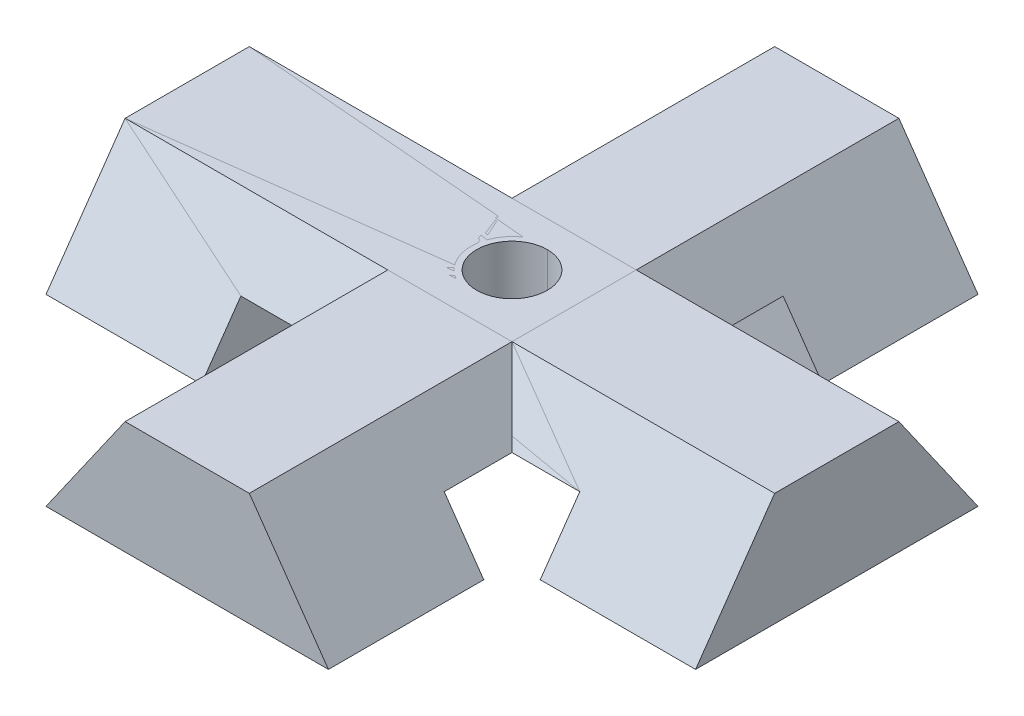
ISO-10303-21;
HEADER;
FILE_DESCRIPTION(('STEP AP214'),'2;1');
FILE_NAME('part.step','',(''),(''),'','','');
FILE_SCHEMA(('AUTOMOTIVE_DESIGN { 1 0 10303 214 1 1 1 1 }'));
ENDSEC;
DATA;
#1=APPLICATION_CONTEXT('core data for automotive mechanical design processes');
#2=APPLICATION_PROTOCOL_DEFINITION('international standard','automotive_design',2000,#1);
#3=PRODUCT_CONTEXT('',#1,'mechanical');
#4=PRODUCT('Part','Part','',(#3));
#5=PRODUCT_RELATED_PRODUCT_CATEGORY('part','',(#4));
#6=PRODUCT_DEFINITION_FORMATION('','',#4);
#7=PRODUCT_DEFINITION_CONTEXT('part definition',#1,'design');
#8=PRODUCT_DEFINITION('design','',#6,#7);
#9=PRODUCT_DEFINITION_SHAPE('','',#8);
#10=(LENGTH_UNIT() NAMED_UNIT(*) SI_UNIT(.MILLI.,.METRE.));
#11=(NAMED_UNIT(*) PLANE_ANGLE_UNIT() SI_UNIT($,.RADIAN.));
#12=(NAMED_UNIT(*) SI_UNIT($,.STERADIAN.) SOLID_ANGLE_UNIT());
#13=UNCERTAINTY_MEASURE_WITH_UNIT(LENGTH_MEASURE(1.E-05),#10,'distance_accuracy_value','');
#14=(GEOMETRIC_REPRESENTATION_CONTEXT(3) GLOBAL_UNCERTAINTY_ASSIGNED_CONTEXT((#13)) GLOBAL_UNIT_ASSIGNED_CONTEXT((#10,
#11,#12)) REPRESENTATION_CONTEXT('',''));
#15=CARTESIAN_POINT('',(0.,0.,0.));
#16=DIRECTION('',(0.,0.,1.));
#17=DIRECTION('',(1.,0.,0.));
#18=AXIS2_PLACEMENT_3D('',#15,#16,#17);
#19=CARTESIAN_POINT('',(0.,-4.,0.));
#20=DIRECTION('',(0.,-1.,0.));
#21=DIRECTION('',(0.,0.,-1.));
#22=AXIS2_PLACEMENT_3D('',#19,#20,#21);
#23=PLANE('',#22);
#24=DIRECTION('',(0.,0.,1.));
#25=VECTOR('',#24,1.);
#26=CARTESIAN_POINT('',(-5.,-4.,11.5));
#27=LINE('',#26,#25);
#28=CARTESIAN_POINT('',(-5.,-4.,6.00000000000002));
#29=VERTEX_POINT('',#28);
#30=CARTESIAN_POINT('',(-5.,-4.,11.5));
#31=VERTEX_POINT('',#30);
#32=EDGE_CURVE('P0_E246',#29,#31,#27,.T.);
#33=ORIENTED_EDGE('',*,*,#32,.F.);
#34=DIRECTION('',(1.,0.,0.));
#35=VECTOR('',#34,1.);
#36=CARTESIAN_POINT('',(0.,-4.,6.));
#37=LINE('',#36,#35);
#38=CARTESIAN_POINT('',(5.,-4.,6.));
#39=VERTEX_POINT('',#38);
#40=EDGE_CURVE('P0_E358',#29,#39,#37,.T.);
#41=ORIENTED_EDGE('',*,*,#40,.T.);
#42=DIRECTION('',(0.,0.,-1.));
#43=VECTOR('',#42,1.);
#44=CARTESIAN_POINT('',(5.,-4.,11.5));
#45=LINE('',#44,#43);
#46=CARTESIAN_POINT('',(5.,-4.,11.5));
#47=VERTEX_POINT('',#46);
#48=EDGE_CURVE('P0_E240',#47,#39,#45,.T.);
#49=ORIENTED_EDGE('',*,*,#48,.F.);
#50=DIRECTION('',(1.,0.,0.));
#51=VECTOR('',#50,1.);
#52=CARTESIAN_POINT('',(-5.,-4.,11.5));
#53=LINE('',#52,#51);
#54=EDGE_CURVE('P0_E242',#31,#47,#53,.T.);
#55=ORIENTED_EDGE('',*,*,#54,.F.);
#56=EDGE_LOOP('',(#33,#41,#49,#55));
#57=FACE_BOUND('',#56,.T.);
#58=ADVANCED_FACE('P0_F51',(#57),#23,.T.);
#59=CARTESIAN_POINT('',(11.5,-4.,-5.));
#60=DIRECTION('',(0.,-0.573576436351041,0.819152044288995));
#61=DIRECTION('',(-1.,0.,0.));
#62=AXIS2_PLACEMENT_3D('',#59,#60,#61);
#63=PLANE('',#62);
#64=DIRECTION('',(-1.,0.,0.));
#65=VECTOR('',#64,1.);
#66=CARTESIAN_POINT('',(0.,-2.,-3.5995849235806));
#67=LINE('',#66,#65);
#68=CARTESIAN_POINT('',(6.,-2.,-3.5995849235806));
#69=VERTEX_POINT('',#68);
#70=CARTESIAN_POINT('',(3.59958492358059,-2.,-3.5995849235806));
#71=VERTEX_POINT('',#70);
#72=EDGE_CURVE('P0_E276',#69,#71,#67,.T.);
#73=ORIENTED_EDGE('',*,*,#72,.T.);
#74=DIRECTION('',(-0.497542812164523,0.710564775461633,0.497542812164519));
#75=VECTOR('',#74,1.);
#76=CARTESIAN_POINT('',(9.70224594007863,-10.7155031665345,-9.70224594007859));
#77=LINE('',#76,#75);
#78=CARTESIAN_POINT('',(2.19916984716118,0.,-2.19916984716119));
#79=VERTEX_POINT('',#78);
#80=EDGE_CURVE('P0_E389',#71,#79,#77,.T.);
#81=ORIENTED_EDGE('',*,*,#80,.T.);
#82=DIRECTION('',(-1.,0.,0.));
#83=VECTOR('',#82,1.);
#84=CARTESIAN_POINT('',(11.5,0.,-2.19916984716119));
#85=LINE('',#84,#83);
#86=CARTESIAN_POINT('',(11.5,0.,-2.19916984716119));
#87=VERTEX_POINT('',#86);
#88=EDGE_CURVE('P0_E301',#87,#79,#85,.T.);
#89=ORIENTED_EDGE('',*,*,#88,.F.);
#90=DIRECTION('',(0.,0.819152044288995,0.573576436351041));
#91=VECTOR('',#90,1.);
#92=CARTESIAN_POINT('',(11.5,-4.,-5.));
#93=LINE('',#92,#91);
#94=CARTESIAN_POINT('',(11.5,-4.,-5.));
#95=VERTEX_POINT('',#94);
#96=EDGE_CURVE('P0_E259',#95,#87,#93,.T.);
#97=ORIENTED_EDGE('',*,*,#96,.F.);
#98=DIRECTION('',(1.,0.,0.));
#99=VECTOR('',#98,1.);
#100=CARTESIAN_POINT('',(11.5,-4.,-5.));
#101=LINE('',#100,#99);
#102=CARTESIAN_POINT('',(6.,-4.,-5.));
#103=VERTEX_POINT('',#102);
#104=EDGE_CURVE('P0_E316',#103,#95,#101,.T.);
#105=ORIENTED_EDGE('',*,*,#104,.F.);
#106=DIRECTION('',(0.,-0.819152044288995,-0.573576436351041));
#107=VECTOR('',#106,1.);
#108=CARTESIAN_POINT('',(6.,-2.,-3.5995849235806));
#109=LINE('',#108,#107);
#110=EDGE_CURVE('P0_E289',#69,#103,#109,.T.);
#111=ORIENTED_EDGE('',*,*,#110,.F.);
#112=EDGE_LOOP('',(#73,#81,#89,#97,#105,#111));
#113=FACE_BOUND('',#112,.T.);
#114=ADVANCED_FACE('P0_F421',(#113),#63,.F.);
#115=CARTESIAN_POINT('',(11.5,0.,2.19916984716119));
#116=DIRECTION('',(0.,-0.573576436351042,-0.819152044288995));
#117=DIRECTION('',(0.,-0.819152044288995,0.573576436351042));
#118=AXIS2_PLACEMENT_3D('',#115,#116,#117);
#119=PLANE('',#118);
#120=DIRECTION('',(-1.,0.,0.));
#121=VECTOR('',#120,1.);
#122=CARTESIAN_POINT('',(11.5,0.,2.19916984716119));
#123=LINE('',#122,#121);
#124=CARTESIAN_POINT('',(11.5,0.,2.19916984716119));
#125=VERTEX_POINT('',#124);
#126=CARTESIAN_POINT('',(2.19916984716117,0.,2.19916984716119));
#127=VERTEX_POINT('',#126);
#128=EDGE_CURVE('P0_E305',#125,#127,#123,.T.);
#129=ORIENTED_EDGE('',*,*,#128,.T.);
#130=DIRECTION('',(0.497542812164523,-0.710564775461633,0.497542812164519));
#131=VECTOR('',#130,1.);
#132=CARTESIAN_POINT('',(1.20359885130097,1.42182273330802,1.203598851301));
#133=LINE('',#132,#131);
#134=CARTESIAN_POINT('',(3.59958492358059,-2.,3.5995849235806));
#135=VERTEX_POINT('',#134);
#136=EDGE_CURVE('P0_E376',#127,#135,#133,.T.);
#137=ORIENTED_EDGE('',*,*,#136,.T.);
#138=DIRECTION('',(1.,0.,0.));
#139=VECTOR('',#138,1.);
#140=CARTESIAN_POINT('',(0.,-2.,3.5995849235806));
#141=LINE('',#140,#139);
#142=CARTESIAN_POINT('',(6.,-2.,3.5995849235806));
#143=VERTEX_POINT('',#142);
#144=EDGE_CURVE('P0_E263',#135,#143,#141,.T.);
#145=ORIENTED_EDGE('',*,*,#144,.T.);
#146=DIRECTION('',(0.,0.819152044288995,-0.573576436351042));
#147=VECTOR('',#146,1.);
#148=CARTESIAN_POINT('',(6.,-4.,5.));
#149=LINE('',#148,#147);
#150=CARTESIAN_POINT('',(6.,-4.,5.));
#151=VERTEX_POINT('',#150);
#152=EDGE_CURVE('P0_E293',#151,#143,#149,.T.);
#153=ORIENTED_EDGE('',*,*,#152,.F.);
#154=DIRECTION('',(-1.,0.,0.));
#155=VECTOR('',#154,1.);
#156=CARTESIAN_POINT('',(11.5,-4.,5.));
#157=LINE('',#156,#155);
#158=CARTESIAN_POINT('',(11.5,-4.,5.));
#159=VERTEX_POINT('',#158);
#160=EDGE_CURVE('P0_E308',#159,#151,#157,.T.);
#161=ORIENTED_EDGE('',*,*,#160,.F.);
#162=DIRECTION('',(0.,-0.819152044288995,0.573576436351042));
#163=VECTOR('',#162,1.);
#164=CARTESIAN_POINT('',(11.5,0.,2.19916984716119));
#165=LINE('',#164,#163);
#166=EDGE_CURVE('P0_E258',#125,#159,#165,.T.);
#167=ORIENTED_EDGE('',*,*,#166,.F.);
#168=EDGE_LOOP('',(#129,#137,#145,#153,#161,#167));
#169=FACE_BOUND('',#168,.T.);
#170=ADVANCED_FACE('P0_F430',(#169),#119,.F.);
#171=CARTESIAN_POINT('',(6.,0.,0.));
#172=DIRECTION('',(-1.,0.,0.));
#173=DIRECTION('',(0.,0.,1.));
#174=AXIS2_PLACEMENT_3D('',#171,#172,#173);
#175=PLANE('',#174);
#176=ORIENTED_EDGE('',*,*,#152,.T.);
#177=DIRECTION('',(0.,0.,-1.));
#178=VECTOR('',#177,1.);
#179=CARTESIAN_POINT('',(6.,-2.,3.5995849235806));
#180=LINE('',#179,#178);
#181=EDGE_CURVE('P0_E234',#143,#69,#180,.T.);
#182=ORIENTED_EDGE('',*,*,#181,.T.);
#183=ORIENTED_EDGE('',*,*,#110,.T.);
#184=DIRECTION('',(0.,0.,1.));
#185=VECTOR('',#184,1.);
#186=CARTESIAN_POINT('',(6.,-4.,-5.));
#187=LINE('',#186,#185);
#188=EDGE_CURVE('P0_E312',#103,#151,#187,.T.);
#189=ORIENTED_EDGE('',*,*,#188,.T.);
#190=EDGE_LOOP('',(#176,#182,#183,#189));
#191=FACE_BOUND('',#190,.T.);
#192=ADVANCED_FACE('P0_F450',(#191),#175,.T.);
#193=CARTESIAN_POINT('',(-6.,0.,0.));
#194=DIRECTION('',(-1.,0.,0.));
#195=DIRECTION('',(0.,0.,1.));
#196=AXIS2_PLACEMENT_3D('',#193,#194,#195);
#197=PLANE('',#196);
#198=DIRECTION('',(0.,-0.819152044288995,0.573576436351042));
#199=VECTOR('',#198,1.);
#200=CARTESIAN_POINT('',(-6.,-2.,3.5995849235806));
#201=LINE('',#200,#199);
#202=CARTESIAN_POINT('',(-6.,-2.,3.5995849235806));
#203=VERTEX_POINT('',#202);
#204=CARTESIAN_POINT('',(-6.,-4.,5.));
#205=VERTEX_POINT('',#204);
#206=EDGE_CURVE('P0_E330',#203,#205,#201,.T.);
#207=ORIENTED_EDGE('',*,*,#206,.T.);
#208=DIRECTION('',(0.,0.,-1.));
#209=VECTOR('',#208,1.);
#210=CARTESIAN_POINT('',(-6.,-4.,5.));
#211=LINE('',#210,#209);
#212=CARTESIAN_POINT('',(-6.,-4.,-5.));
#213=VERTEX_POINT('',#212);
#214=EDGE_CURVE('P0_E323',#205,#213,#211,.T.);
#215=ORIENTED_EDGE('',*,*,#214,.T.);
#216=DIRECTION('',(0.,0.819152044288995,0.573576436351041));
#217=VECTOR('',#216,1.);
#218=CARTESIAN_POINT('',(-6.,-4.,-5.));
#219=LINE('',#218,#217);
#220=CARTESIAN_POINT('',(-6.,-2.,-3.5995849235806));
#221=VERTEX_POINT('',#220);
#222=EDGE_CURVE('P0_E292',#213,#221,#219,.T.);
#223=ORIENTED_EDGE('',*,*,#222,.T.);
#224=DIRECTION('',(0.,0.,1.));
#225=VECTOR('',#224,1.);
#226=CARTESIAN_POINT('',(-6.,-2.,-3.5995849235806));
#227=LINE('',#226,#225);
#228=EDGE_CURVE('P0_E264',#221,#203,#227,.T.);
#229=ORIENTED_EDGE('',*,*,#228,.T.);
#230=EDGE_LOOP('',(#207,#215,#223,#229));
#231=FACE_BOUND('',#230,.T.);
#232=ADVANCED_FACE('P0_F53',(#231),#197,.F.);
#233=CARTESIAN_POINT('',(-2.19916984716117,0.,-2.1991698471612));
#234=VERTEX_POINT('',#233);
#235=CARTESIAN_POINT('',(-11.5,0.,-2.19916984716119));
#236=VERTEX_POINT('',#235);
#237=EDGE_CURVE('P0_E300',#234,#236,#85,.T.);
#238=ORIENTED_EDGE('',*,*,#237,.F.);
#239=DIRECTION('',(-0.497542812164523,-0.710564775461633,-0.497542812164519));
#240=VECTOR('',#239,1.);
#241=CARTESIAN_POINT('',(-12.1777344394444,-14.2508671326169,-12.1777344394444));
#242=LINE('',#241,#240);
#243=CARTESIAN_POINT('',(-3.59958492358059,-2.,-3.5995849235806));
#244=VERTEX_POINT('',#243);
#245=EDGE_CURVE('P0_E214',#234,#244,#242,.T.);
#246=ORIENTED_EDGE('',*,*,#245,.T.);
#247=EDGE_CURVE('P0_E268',#244,#221,#67,.T.);
#248=ORIENTED_EDGE('',*,*,#247,.T.);
#249=ORIENTED_EDGE('',*,*,#222,.F.);
#250=DIRECTION('',(1.,0.,0.));
#251=VECTOR('',#250,1.);
#252=CARTESIAN_POINT('',(-11.5,-4.,-5.));
#253=LINE('',#252,#251);
#254=CARTESIAN_POINT('',(-11.5,-4.,-5.));
#255=VERTEX_POINT('',#254);
#256=EDGE_CURVE('P0_E319',#255,#213,#253,.T.);
#257=ORIENTED_EDGE('',*,*,#256,.F.);
#258=DIRECTION('',(0.,0.819152044288995,0.573576436351041));
#259=VECTOR('',#258,1.);
#260=CARTESIAN_POINT('',(-11.5,-4.,-5.));
#261=LINE('',#260,#259);
#262=EDGE_CURVE('P0_E253',#255,#236,#261,.T.);
#263=ORIENTED_EDGE('',*,*,#262,.T.);
#264=EDGE_LOOP('',(#238,#246,#248,#249,#257,#263));
#265=FACE_BOUND('',#264,.T.);
#266=ADVANCED_FACE('P0_F433',(#265),#63,.F.);
#267=CARTESIAN_POINT('',(-3.59958492358059,-2.,3.5995849235806));
#268=VERTEX_POINT('',#267);
#269=EDGE_CURVE('P0_E269',#203,#268,#141,.T.);
#270=ORIENTED_EDGE('',*,*,#269,.T.);
#271=DIRECTION('',(0.497542812164522,0.710564775461633,-0.497542812164519));
#272=VECTOR('',#271,1.);
#273=CARTESIAN_POINT('',(-3.31108672093686,-1.58798186694567,3.31108672093687));
#274=LINE('',#273,#272);
#275=CARTESIAN_POINT('',(-2.19916984716118,0.,2.19916984716119));
#276=VERTEX_POINT('',#275);
#277=EDGE_CURVE('P0_E382',#268,#276,#274,.T.);
#278=ORIENTED_EDGE('',*,*,#277,.T.);
#279=CARTESIAN_POINT('',(-11.5,0.,2.19916984716119));
#280=VERTEX_POINT('',#279);
#281=EDGE_CURVE('P0_E304',#276,#280,#123,.T.);
#282=ORIENTED_EDGE('',*,*,#281,.T.);
#283=DIRECTION('',(0.,-0.819152044288995,0.573576436351042));
#284=VECTOR('',#283,1.);
#285=CARTESIAN_POINT('',(-11.5,0.,2.19916984716119));
#286=LINE('',#285,#284);
#287=CARTESIAN_POINT('',(-11.5,-4.,5.));
#288=VERTEX_POINT('',#287);
#289=EDGE_CURVE('P0_E252',#280,#288,#286,.T.);
#290=ORIENTED_EDGE('',*,*,#289,.T.);
#291=DIRECTION('',(-1.,0.,0.));
#292=VECTOR('',#291,1.);
#293=CARTESIAN_POINT('',(-11.5,-4.,5.));
#294=LINE('',#293,#292);
#295=EDGE_CURVE('P0_E327',#205,#288,#294,.T.);
#296=ORIENTED_EDGE('',*,*,#295,.F.);
#297=ORIENTED_EDGE('',*,*,#206,.F.);
#298=EDGE_LOOP('',(#270,#278,#282,#290,#296,#297));
#299=FACE_BOUND('',#298,.T.);
#300=ADVANCED_FACE('P0_F474',(#299),#119,.F.);
#301=CARTESIAN_POINT('',(0.,-4.,0.));
#302=DIRECTION('',(0.,-1.,0.));
#303=DIRECTION('',(0.,0.,-1.));
#304=AXIS2_PLACEMENT_3D('',#301,#302,#303);
#305=PLANE('',#304);
#306=DIRECTION('',(0.,0.,-1.));
#307=VECTOR('',#306,1.);
#308=CARTESIAN_POINT('',(-11.5,-4.,5.));
#309=LINE('',#308,#307);
#310=EDGE_CURVE('P0_E248',#288,#255,#309,.T.);
#311=ORIENTED_EDGE('',*,*,#310,.T.);
#312=ORIENTED_EDGE('',*,*,#256,.T.);
#313=ORIENTED_EDGE('',*,*,#214,.F.);
#314=ORIENTED_EDGE('',*,*,#295,.T.);
#315=EDGE_LOOP('',(#311,#312,#313,#314));
#316=FACE_BOUND('',#315,.T.);
#317=ADVANCED_FACE('P0_F560',(#316),#305,.T.);
#318=CARTESIAN_POINT('',(0.,-4.,0.));
#319=DIRECTION('',(0.,1.,0.));
#320=DIRECTION('',(1.,0.,0.));
#321=AXIS2_PLACEMENT_3D('',#318,#319,#320);
#322=PLANE('',#321);
#323=DIRECTION('',(0.,0.,1.));
#324=VECTOR('',#323,1.);
#325=CARTESIAN_POINT('',(11.5,-4.,5.));
#326=LINE('',#325,#324);
#327=EDGE_CURVE('P0_E282',#95,#159,#326,.T.);
#328=ORIENTED_EDGE('',*,*,#327,.T.);
#329=ORIENTED_EDGE('',*,*,#160,.T.);
#330=ORIENTED_EDGE('',*,*,#188,.F.);
#331=ORIENTED_EDGE('',*,*,#104,.T.);
#332=EDGE_LOOP('',(#328,#329,#330,#331));
#333=FACE_BOUND('',#332,.T.);
#334=ADVANCED_FACE('P0_F562',(#333),#322,.F.);
#335=CARTESIAN_POINT('',(0.,0.,0.));
#336=DIRECTION('',(0.,-1.,0.));
#337=DIRECTION('',(0.,0.,-1.));
#338=AXIS2_PLACEMENT_3D('',#335,#336,#337);
#339=PLANE('',#338);
#340=CARTESIAN_POINT('',(0.,0.,0.));
#341=DIRECTION('',(0.,1.,0.));
#342=DIRECTION('',(0.,0.,1.));
#343=AXIS2_PLACEMENT_3D('',#340,#341,#342);
#344=CIRCLE('',#343,1.45);
#345=CARTESIAN_POINT('',(0.,0.,1.45));
#346=VERTEX_POINT('',#345);
#347=EDGE_CURVE('P0_E395',#346,#346,#344,.T.);
#348=ORIENTED_EDGE('',*,*,#347,.F.);
#349=EDGE_LOOP('',(#348));
#350=FACE_BOUND('',#349,.T.);
#351=DIRECTION('',(0.,0.,-1.));
#352=VECTOR('',#351,1.);
#353=CARTESIAN_POINT('',(-2.19916984716117,0.,1.82254544707369));
#354=LINE('',#353,#352);
#355=CARTESIAN_POINT('',(-2.19916984716117,0.,-11.5));
#356=VERTEX_POINT('',#355);
#357=EDGE_CURVE('P0_E207',#234,#356,#354,.T.);
#358=ORIENTED_EDGE('',*,*,#357,.F.);
#359=ORIENTED_EDGE('',*,*,#237,.T.);
#360=DIRECTION('',(0.,0.,1.));
#361=VECTOR('',#360,1.);
#362=CARTESIAN_POINT('',(-11.5,0.,5.));
#363=LINE('',#362,#361);
#364=EDGE_CURVE('P0_E273',#236,#280,#363,.T.);
#365=ORIENTED_EDGE('',*,*,#364,.T.);
#366=ORIENTED_EDGE('',*,*,#281,.F.);
#367=DIRECTION('',(0.,0.,1.));
#368=VECTOR('',#367,1.);
#369=CARTESIAN_POINT('',(-2.19916984716118,0.,-1.8225454470737));
#370=LINE('',#369,#368);
#371=CARTESIAN_POINT('',(-2.19916984716118,0.,11.5));
#372=VERTEX_POINT('',#371);
#373=EDGE_CURVE('P0_E369',#276,#372,#370,.T.);
#374=ORIENTED_EDGE('',*,*,#373,.T.);
#375=DIRECTION('',(1.,0.,0.));
#376=VECTOR('',#375,1.);
#377=CARTESIAN_POINT('',(-5.,0.,11.5));
#378=LINE('',#377,#376);
#379=CARTESIAN_POINT('',(2.19916984716117,0.,11.5));
#380=VERTEX_POINT('',#379);
#381=EDGE_CURVE('P0_E231',#372,#380,#378,.T.);
#382=ORIENTED_EDGE('',*,*,#381,.T.);
#383=DIRECTION('',(0.,0.,1.));
#384=VECTOR('',#383,1.);
#385=CARTESIAN_POINT('',(2.19916984716117,0.,-1.8225454470737));
#386=LINE('',#385,#384);
#387=EDGE_CURVE('P0_E375',#127,#380,#386,.T.);
#388=ORIENTED_EDGE('',*,*,#387,.F.);
#389=ORIENTED_EDGE('',*,*,#128,.F.);
#390=DIRECTION('',(0.,0.,-1.));
#391=VECTOR('',#390,1.);
#392=CARTESIAN_POINT('',(11.5,0.,5.));
#393=LINE('',#392,#391);
#394=EDGE_CURVE('P0_E254',#125,#87,#393,.T.);
#395=ORIENTED_EDGE('',*,*,#394,.T.);
#396=ORIENTED_EDGE('',*,*,#88,.T.);
#397=DIRECTION('',(0.,0.,-1.));
#398=VECTOR('',#397,1.);
#399=CARTESIAN_POINT('',(2.19916984716118,0.,1.82254544707369));
#400=LINE('',#399,#398);
#401=CARTESIAN_POINT('',(2.19916984716118,0.,-11.5));
#402=VERTEX_POINT('',#401);
#403=EDGE_CURVE('P0_E226',#79,#402,#400,.T.);
#404=ORIENTED_EDGE('',*,*,#403,.T.);
#405=DIRECTION('',(-1.,0.,0.));
#406=VECTOR('',#405,1.);
#407=CARTESIAN_POINT('',(-5.,0.,-11.5));
#408=LINE('',#407,#406);
#409=EDGE_CURVE('P0_E223',#402,#356,#408,.T.);
#410=ORIENTED_EDGE('',*,*,#409,.T.);
#411=EDGE_LOOP('',(#358,#359,#365,#366,#374,#382,#388,#389,#395,#396,#404,#410));
#412=FACE_BOUND('',#411,.T.);
#413=ADVANCED_FACE('P0_F229',(#350,#412),#339,.F.);
#414=CARTESIAN_POINT('',(-11.5,-2.,5.));
#415=DIRECTION('',(-1.,0.,0.));
#416=DIRECTION('',(0.,0.,1.));
#417=AXIS2_PLACEMENT_3D('',#414,#415,#416);
#418=PLANE('',#417);
#419=ORIENTED_EDGE('',*,*,#262,.F.);
#420=ORIENTED_EDGE('',*,*,#310,.F.);
#421=ORIENTED_EDGE('',*,*,#289,.F.);
#422=ORIENTED_EDGE('',*,*,#364,.F.);
#423=EDGE_LOOP('',(#419,#420,#421,#422));
#424=FACE_BOUND('',#423,.T.);
#425=ADVANCED_FACE('P0_F416',(#424),#418,.T.);
#426=CARTESIAN_POINT('',(11.5,-2.,5.));
#427=DIRECTION('',(1.,0.,0.));
#428=DIRECTION('',(0.,1.,0.));
#429=AXIS2_PLACEMENT_3D('',#426,#427,#428);
#430=PLANE('',#429);
#431=ORIENTED_EDGE('',*,*,#96,.T.);
#432=ORIENTED_EDGE('',*,*,#394,.F.);
#433=ORIENTED_EDGE('',*,*,#166,.T.);
#434=ORIENTED_EDGE('',*,*,#327,.F.);
#435=EDGE_LOOP('',(#431,#432,#433,#434));
#436=FACE_BOUND('',#435,.T.);
#437=ADVANCED_FACE('P0_F406',(#436),#430,.T.);
#438=CARTESIAN_POINT('',(0.,-2.,0.));
#439=DIRECTION('',(0.,-1.,0.));
#440=DIRECTION('',(0.,0.,-1.));
#441=AXIS2_PLACEMENT_3D('',#438,#439,#440);
#442=PLANE('',#441);
#443=CARTESIAN_POINT('',(0.,-2.,0.));
#444=DIRECTION('',(0.,-1.,0.));
#445=DIRECTION('',(0.,0.,-1.));
#446=AXIS2_PLACEMENT_3D('',#443,#444,#445);
#447=CIRCLE('',#446,1.45);
#448=CARTESIAN_POINT('',(0.,-2.,-1.45));
#449=VERTEX_POINT('',#448);
#450=EDGE_CURVE('P0_E55',#449,#449,#447,.T.);
#451=ORIENTED_EDGE('',*,*,#450,.F.);
#452=EDGE_LOOP('',(#451));
#453=FACE_BOUND('',#452,.T.);
#454=ORIENTED_EDGE('',*,*,#247,.F.);
#455=DIRECTION('',(0.,0.,1.));
#456=VECTOR('',#455,1.);
#457=CARTESIAN_POINT('',(-3.59958492358059,-2.,0.));
#458=LINE('',#457,#456);
#459=CARTESIAN_POINT('',(-3.59958492358059,-2.,-5.99999999999999));
#460=VERTEX_POINT('',#459);
#461=EDGE_CURVE('P0_E356',#460,#244,#458,.T.);
#462=ORIENTED_EDGE('',*,*,#461,.F.);
#463=DIRECTION('',(-1.,0.,0.));
#464=VECTOR('',#463,1.);
#465=CARTESIAN_POINT('',(0.,-2.,-6.));
#466=LINE('',#465,#464);
#467=CARTESIAN_POINT('',(3.59958492358059,-2.,-6.00000000000001));
#468=VERTEX_POINT('',#467);
#469=EDGE_CURVE('P0_E348',#468,#460,#466,.T.);
#470=ORIENTED_EDGE('',*,*,#469,.F.);
#471=DIRECTION('',(0.,0.,-1.));
#472=VECTOR('',#471,1.);
#473=CARTESIAN_POINT('',(3.59958492358059,-2.,0.));
#474=LINE('',#473,#472);
#475=EDGE_CURVE('P0_E67',#71,#468,#474,.T.);
#476=ORIENTED_EDGE('',*,*,#475,.F.);
#477=ORIENTED_EDGE('',*,*,#72,.F.);
#478=ORIENTED_EDGE('',*,*,#181,.F.);
#479=ORIENTED_EDGE('',*,*,#144,.F.);
#480=DIRECTION('',(0.,0.,-1.));
#481=VECTOR('',#480,1.);
#482=CARTESIAN_POINT('',(3.59958492358059,-2.,0.));
#483=LINE('',#482,#481);
#484=CARTESIAN_POINT('',(3.59958492358059,-2.,5.99999999999999));
#485=VERTEX_POINT('',#484);
#486=EDGE_CURVE('P0_E366',#485,#135,#483,.T.);
#487=ORIENTED_EDGE('',*,*,#486,.F.);
#488=DIRECTION('',(-1.,0.,0.));
#489=VECTOR('',#488,1.);
#490=CARTESIAN_POINT('',(0.,-2.,6.));
#491=LINE('',#490,#489);
#492=CARTESIAN_POINT('',(-3.59958492358059,-2.,6.00000000000001));
#493=VERTEX_POINT('',#492);
#494=EDGE_CURVE('P0_E361',#485,#493,#491,.T.);
#495=ORIENTED_EDGE('',*,*,#494,.T.);
#496=DIRECTION('',(0.,0.,1.));
#497=VECTOR('',#496,1.);
#498=CARTESIAN_POINT('',(-3.59958492358059,-2.,0.));
#499=LINE('',#498,#497);
#500=EDGE_CURVE('P0_E75',#268,#493,#499,.T.);
#501=ORIENTED_EDGE('',*,*,#500,.F.);
#502=ORIENTED_EDGE('',*,*,#269,.F.);
#503=ORIENTED_EDGE('',*,*,#228,.F.);
#504=EDGE_LOOP('',(#454,#462,#470,#476,#477,#478,#479,#487,#495,#501,#502,#503));
#505=FACE_BOUND('',#504,.T.);
#506=ADVANCED_FACE('P0_F354',(#453,#505),#442,.T.);
#507=CARTESIAN_POINT('',(-5.,-29.0798724079689,11.5));
#508=DIRECTION('',(0.,0.,1.));
#509=DIRECTION('',(1.,0.,0.));
#510=AXIS2_PLACEMENT_3D('',#507,#508,#509);
#511=PLANE('',#510);
#512=DIRECTION('',(0.573576436351044,0.819152044288993,0.));
#513=VECTOR('',#512,1.);
#514=CARTESIAN_POINT('',(-5.,-4.,11.5));
#515=LINE('',#514,#513);
#516=EDGE_CURVE('P0_E374',#31,#372,#515,.T.);
#517=ORIENTED_EDGE('',*,*,#516,.F.);
#518=ORIENTED_EDGE('',*,*,#54,.T.);
#519=DIRECTION('',(0.573576436351044,-0.819152044288993,0.));
#520=VECTOR('',#519,1.);
#521=CARTESIAN_POINT('',(2.19916984716117,0.,11.5));
#522=LINE('',#521,#520);
#523=EDGE_CURVE('P0_E372',#380,#47,#522,.T.);
#524=ORIENTED_EDGE('',*,*,#523,.F.);
#525=ORIENTED_EDGE('',*,*,#381,.F.);
#526=EDGE_LOOP('',(#517,#518,#524,#525));
#527=FACE_BOUND('',#526,.T.);
#528=ADVANCED_FACE('P0_F405',(#527),#511,.T.);
#529=CARTESIAN_POINT('',(-5.,-29.0798724079689,-11.5));
#530=DIRECTION('',(0.,0.,-1.));
#531=DIRECTION('',(-1.,0.,0.));
#532=AXIS2_PLACEMENT_3D('',#529,#530,#531);
#533=PLANE('',#532);
#534=DIRECTION('',(-0.573576436351044,-0.819152044288993,0.));
#535=VECTOR('',#534,1.);
#536=CARTESIAN_POINT('',(-16.7836855160102,-20.828846981766,-11.5));
#537=LINE('',#536,#535);
#538=CARTESIAN_POINT('',(-5.,-4.,-11.5));
#539=VERTEX_POINT('',#538);
#540=EDGE_CURVE('P0_E211',#356,#539,#537,.T.);
#541=ORIENTED_EDGE('',*,*,#540,.F.);
#542=ORIENTED_EDGE('',*,*,#409,.F.);
#543=DIRECTION('',(-0.573576436351044,0.819152044288993,0.));
#544=VECTOR('',#543,1.);
#545=CARTESIAN_POINT('',(13.4937862326386,-16.1303838778365,-11.5));
#546=LINE('',#545,#544);
#547=CARTESIAN_POINT('',(5.,-3.99999999999999,-11.5));
#548=VERTEX_POINT('',#547);
#549=EDGE_CURVE('P0_E392',#548,#402,#546,.T.);
#550=ORIENTED_EDGE('',*,*,#549,.F.);
#551=DIRECTION('',(-1.,0.,0.));
#552=VECTOR('',#551,1.);
#553=CARTESIAN_POINT('',(-5.,-4.,-11.5));
#554=LINE('',#553,#552);
#555=EDGE_CURVE('P0_E225',#548,#539,#554,.T.);
#556=ORIENTED_EDGE('',*,*,#555,.T.);
#557=EDGE_LOOP('',(#541,#542,#550,#556));
#558=FACE_BOUND('',#557,.T.);
#559=ADVANCED_FACE('P0_F221',(#558),#533,.T.);
#560=DIRECTION('',(1.,0.,0.));
#561=VECTOR('',#560,1.);
#562=CARTESIAN_POINT('',(0.,-4.,-6.));
#563=LINE('',#562,#561);
#564=CARTESIAN_POINT('',(-5.,-4.,-5.99999999999998));
#565=VERTEX_POINT('',#564);
#566=CARTESIAN_POINT('',(5.,-3.99999999999999,-6.00000000000002));
#567=VERTEX_POINT('',#566);
#568=EDGE_CURVE('P0_E350',#565,#567,#563,.T.);
#569=ORIENTED_EDGE('',*,*,#568,.F.);
#570=EDGE_CURVE('P0_E236',#539,#565,#27,.T.);
#571=ORIENTED_EDGE('',*,*,#570,.F.);
#572=ORIENTED_EDGE('',*,*,#555,.F.);
#573=EDGE_CURVE('P0_E243',#567,#548,#45,.T.);
#574=ORIENTED_EDGE('',*,*,#573,.F.);
#575=EDGE_LOOP('',(#569,#571,#572,#574));
#576=FACE_BOUND('',#575,.T.);
#577=ADVANCED_FACE('P0_F424',(#576),#23,.T.);
#578=CARTESIAN_POINT('',(0.,13.6204993518133,-6.));
#579=DIRECTION('',(0.,0.,-1.));
#580=DIRECTION('',(-1.,0.,0.));
#581=AXIS2_PLACEMENT_3D('',#578,#579,#580);
#582=PLANE('',#581);
#583=ORIENTED_EDGE('',*,*,#469,.T.);
#584=DIRECTION('',(-0.573576436351044,-0.819152044288993,0.));
#585=VECTOR('',#584,1.);
#586=CARTESIAN_POINT('',(4.92387624941673,10.17276408476,-6.00000000000002));
#587=LINE('',#586,#585);
#588=EDGE_CURVE('P0_E11',#460,#565,#587,.T.);
#589=ORIENTED_EDGE('',*,*,#588,.T.);
#590=ORIENTED_EDGE('',*,*,#568,.T.);
#591=DIRECTION('',(-0.573576436351044,0.819152044288993,0.));
#592=VECTOR('',#591,1.);
#593=CARTESIAN_POINT('',(-4.92387624941675,10.17276408476,-5.99999999999998));
#594=LINE('',#593,#592);
#595=EDGE_CURVE('P0_E60',#567,#468,#594,.T.);
#596=ORIENTED_EDGE('',*,*,#595,.T.);
#597=EDGE_LOOP('',(#583,#589,#590,#596));
#598=FACE_BOUND('',#597,.T.);
#599=ADVANCED_FACE('P0_F347',(#598),#582,.F.);
#600=CARTESIAN_POINT('',(0.,13.6204993518133,6.));
#601=DIRECTION('',(0.,0.,-1.));
#602=DIRECTION('',(-1.,0.,0.));
#603=AXIS2_PLACEMENT_3D('',#600,#601,#602);
#604=PLANE('',#603);
#605=DIRECTION('',(-0.573576436351044,-0.819152044288993,0.));
#606=VECTOR('',#605,1.);
#607=CARTESIAN_POINT('',(4.92387624941674,10.17276408476,5.99999999999998));
#608=LINE('',#607,#606);
#609=EDGE_CURVE('P0_E341',#493,#29,#608,.T.);
#610=ORIENTED_EDGE('',*,*,#609,.F.);
#611=ORIENTED_EDGE('',*,*,#494,.F.);
#612=DIRECTION('',(-0.573576436351045,0.819152044288993,0.));
#613=VECTOR('',#612,1.);
#614=CARTESIAN_POINT('',(-4.92387624941674,10.17276408476,6.00000000000002));
#615=LINE('',#614,#613);
#616=EDGE_CURVE('P0_E339',#39,#485,#615,.T.);
#617=ORIENTED_EDGE('',*,*,#616,.F.);
#618=ORIENTED_EDGE('',*,*,#40,.F.);
#619=EDGE_LOOP('',(#610,#611,#617,#618));
#620=FACE_BOUND('',#619,.T.);
#621=ADVANCED_FACE('P0_F442',(#620),#604,.T.);
#622=CARTESIAN_POINT('',(2.19916984716117,0.,-1.8225454470737));
#623=DIRECTION('',(-0.819152044288993,-0.573576436351045,0.));
#624=DIRECTION('',(0.573576436351045,-0.819152044288993,0.));
#625=AXIS2_PLACEMENT_3D('',#622,#623,#624);
#626=PLANE('',#625);
#627=ORIENTED_EDGE('',*,*,#486,.T.);
#628=ORIENTED_EDGE('',*,*,#136,.F.);
#629=ORIENTED_EDGE('',*,*,#387,.T.);
#630=ORIENTED_EDGE('',*,*,#523,.T.);
#631=ORIENTED_EDGE('',*,*,#48,.T.);
#632=ORIENTED_EDGE('',*,*,#616,.T.);
#633=EDGE_LOOP('',(#627,#628,#629,#630,#631,#632));
#634=FACE_BOUND('',#633,.T.);
#635=ADVANCED_FACE('P0_F531',(#634),#626,.F.);
#636=CARTESIAN_POINT('',(-5.,-4.,-1.8225454470737));
#637=DIRECTION('',(0.819152044288993,-0.573576436351044,0.));
#638=DIRECTION('',(0.573576436351044,0.819152044288993,0.));
#639=AXIS2_PLACEMENT_3D('',#636,#637,#638);
#640=PLANE('',#639);
#641=ORIENTED_EDGE('',*,*,#500,.T.);
#642=ORIENTED_EDGE('',*,*,#609,.T.);
#643=ORIENTED_EDGE('',*,*,#32,.T.);
#644=ORIENTED_EDGE('',*,*,#516,.T.);
#645=ORIENTED_EDGE('',*,*,#373,.F.);
#646=ORIENTED_EDGE('',*,*,#277,.F.);
#647=EDGE_LOOP('',(#641,#642,#643,#644,#645,#646));
#648=FACE_BOUND('',#647,.T.);
#649=ADVANCED_FACE('P0_F493',(#648),#640,.F.);
#650=CARTESIAN_POINT('',(13.4937862326386,-16.1303838778365,1.82254544707369));
#651=DIRECTION('',(-0.819152044288993,-0.573576436351044,0.));
#652=DIRECTION('',(0.573576436351044,-0.819152044288993,0.));
#653=AXIS2_PLACEMENT_3D('',#650,#651,#652);
#654=PLANE('',#653);
#655=ORIENTED_EDGE('',*,*,#475,.T.);
#656=ORIENTED_EDGE('',*,*,#595,.F.);
#657=ORIENTED_EDGE('',*,*,#573,.T.);
#658=ORIENTED_EDGE('',*,*,#549,.T.);
#659=ORIENTED_EDGE('',*,*,#403,.F.);
#660=ORIENTED_EDGE('',*,*,#80,.F.);
#661=EDGE_LOOP('',(#655,#656,#657,#658,#659,#660));
#662=FACE_BOUND('',#661,.T.);
#663=ADVANCED_FACE('P0_F445',(#662),#654,.F.);
#664=CARTESIAN_POINT('',(-16.7836855160102,-20.828846981766,1.82254544707369));
#665=DIRECTION('',(0.819152044288993,-0.573576436351044,0.));
#666=DIRECTION('',(0.573576436351044,0.819152044288993,0.));
#667=AXIS2_PLACEMENT_3D('',#664,#665,#666);
#668=PLANE('',#667);
#669=ORIENTED_EDGE('',*,*,#461,.T.);
#670=ORIENTED_EDGE('',*,*,#245,.F.);
#671=ORIENTED_EDGE('',*,*,#357,.T.);
#672=ORIENTED_EDGE('',*,*,#540,.T.);
#673=ORIENTED_EDGE('',*,*,#570,.T.);
#674=ORIENTED_EDGE('',*,*,#588,.F.);
#675=EDGE_LOOP('',(#669,#670,#671,#672,#673,#674));
#676=FACE_BOUND('',#675,.T.);
#677=ADVANCED_FACE('P0_F210',(#676),#668,.F.);
#678=CARTESIAN_POINT('',(0.,-10.,0.));
#679=DIRECTION('',(0.,1.,0.));
#680=DIRECTION('',(0.,0.,1.));
#681=AXIS2_PLACEMENT_3D('',#678,#679,#680);
#682=CYLINDRICAL_SURFACE('',#681,1.45);
#683=ORIENTED_EDGE('',*,*,#450,.T.);
#684=EDGE_LOOP('',(#683));
#685=FACE_BOUND('',#684,.T.);
#686=ORIENTED_EDGE('',*,*,#347,.T.);
#687=EDGE_LOOP('',(#686));
#688=FACE_BOUND('',#687,.T.);
#689=ADVANCED_FACE('P0_F402',(#685,#688),#682,.F.);
#690=CLOSED_SHELL('',(#58,#114,#170,#192,#232,#266,#300,#317,#334,#413,#425,#437,#506,#528,#559,
#577,#599,#621,#635,#649,#663,#677,#689));
#691=MANIFOLD_SOLID_BREP('P0_B2',#690);
#692=CARTESIAN_POINT('',(6.,0.,0.));
#693=DIRECTION('',(-1.,0.,0.));
#694=DIRECTION('',(0.,0.,1.));
#695=AXIS2_PLACEMENT_3D('',#692,#693,#694);
#696=PLANE('',#695);
#697=DIRECTION('',(0.,0.819152044288995,-0.573576436351042));
#698=VECTOR('',#697,1.);
#699=CARTESIAN_POINT('',(6.,-4.,5.));
#700=LINE('',#699,#698);
#701=CARTESIAN_POINT('',(6.,-4.,5.));
#702=VERTEX_POINT('',#701);
#703=CARTESIAN_POINT('',(6.,-2.,3.5995849235806));
#704=VERTEX_POINT('',#703);
#705=EDGE_CURVE('P1_E183',#702,#704,#700,.T.);
#706=ORIENTED_EDGE('',*,*,#705,.T.);
#707=DIRECTION('',(0.,0.,-1.));
#708=VECTOR('',#707,1.);
#709=CARTESIAN_POINT('',(6.,-2.,3.5995849235806));
#710=LINE('',#709,#708);
#711=CARTESIAN_POINT('',(6.,-2.,-3.5995849235806));
#712=VERTEX_POINT('',#711);
#713=EDGE_CURVE('P1_E194',#704,#712,#710,.T.);
#714=ORIENTED_EDGE('',*,*,#713,.T.);
#715=DIRECTION('',(0.,-0.819152044288995,-0.573576436351041));
#716=VECTOR('',#715,1.);
#717=CARTESIAN_POINT('',(6.,-2.,-3.5995849235806));
#718=LINE('',#717,#716);
#719=CARTESIAN_POINT('',(6.,-4.,-5.));
#720=VERTEX_POINT('',#719);
#721=EDGE_CURVE('P1_E24',#712,#720,#718,.T.);
#722=ORIENTED_EDGE('',*,*,#721,.T.);
#723=DIRECTION('',(0.,0.,1.));
#724=VECTOR('',#723,1.);
#725=CARTESIAN_POINT('',(6.,-4.,-5.));
#726=LINE('',#725,#724);
#727=EDGE_CURVE('P1_E172',#720,#702,#726,.T.);
#728=ORIENTED_EDGE('',*,*,#727,.T.);
#729=EDGE_LOOP('',(#706,#714,#722,#728));
#730=FACE_BOUND('',#729,.T.);
#731=ADVANCED_FACE('P1_F15',(#730),#696,.T.);
#732=CARTESIAN_POINT('',(-6.,0.,0.));
#733=DIRECTION('',(-1.,0.,0.));
#734=DIRECTION('',(0.,0.,1.));
#735=AXIS2_PLACEMENT_3D('',#732,#733,#734);
#736=PLANE('',#735);
#737=DIRECTION('',(0.,-0.819152044288995,0.573576436351042));
#738=VECTOR('',#737,1.);
#739=CARTESIAN_POINT('',(-6.,-2.,3.5995849235806));
#740=LINE('',#739,#738);
#741=CARTESIAN_POINT('',(-6.,-2.,3.5995849235806));
#742=VERTEX_POINT('',#741);
#743=CARTESIAN_POINT('',(-6.,-4.,5.));
#744=VERTEX_POINT('',#743);
#745=EDGE_CURVE('P1_E37',#742,#744,#740,.T.);
#746=ORIENTED_EDGE('',*,*,#745,.T.);
#747=DIRECTION('',(0.,0.,-1.));
#748=VECTOR('',#747,1.);
#749=CARTESIAN_POINT('',(-6.,-4.,5.));
#750=LINE('',#749,#748);
#751=CARTESIAN_POINT('',(-6.,-4.,-5.));
#752=VERTEX_POINT('',#751);
#753=EDGE_CURVE('P1_E127',#744,#752,#750,.T.);
#754=ORIENTED_EDGE('',*,*,#753,.T.);
#755=DIRECTION('',(0.,0.819152044288995,0.573576436351041));
#756=VECTOR('',#755,1.);
#757=CARTESIAN_POINT('',(-6.,-4.,-5.));
#758=LINE('',#757,#756);
#759=CARTESIAN_POINT('',(-6.,-2.,-3.5995849235806));
#760=VERTEX_POINT('',#759);
#761=EDGE_CURVE('P1_E10',#752,#760,#758,.T.);
#762=ORIENTED_EDGE('',*,*,#761,.T.);
#763=DIRECTION('',(0.,0.,1.));
#764=VECTOR('',#763,1.);
#765=CARTESIAN_POINT('',(-6.,-2.,-3.5995849235806));
#766=LINE('',#765,#764);
#767=EDGE_CURVE('P1_E212',#760,#742,#766,.T.);
#768=ORIENTED_EDGE('',*,*,#767,.T.);
#769=EDGE_LOOP('',(#746,#754,#762,#768));
#770=FACE_BOUND('',#769,.T.);
#771=ADVANCED_FACE('P1_F17',(#770),#736,.F.);
#772=CARTESIAN_POINT('',(11.5,-4.,-5.));
#773=DIRECTION('',(0.,-0.573576436351041,0.819152044288995));
#774=DIRECTION('',(-1.,0.,0.));
#775=AXIS2_PLACEMENT_3D('',#772,#773,#774);
#776=PLANE('',#775);
#777=ORIENTED_EDGE('',*,*,#721,.F.);
#778=DIRECTION('',(-1.,0.,0.));
#779=VECTOR('',#778,1.);
#780=CARTESIAN_POINT('',(0.,-2.,-3.5995849235806));
#781=LINE('',#780,#779);
#782=EDGE_CURVE('P1_E215',#712,#760,#781,.T.);
#783=ORIENTED_EDGE('',*,*,#782,.T.);
#784=ORIENTED_EDGE('',*,*,#761,.F.);
#785=DIRECTION('',(1.,0.,0.));
#786=VECTOR('',#785,1.);
#787=CARTESIAN_POINT('',(-11.5,-4.,-5.));
#788=LINE('',#787,#786);
#789=CARTESIAN_POINT('',(-11.5,-4.,-5.));
#790=VERTEX_POINT('',#789);
#791=EDGE_CURVE('P1_E119',#790,#752,#788,.T.);
#792=ORIENTED_EDGE('',*,*,#791,.F.);
#793=DIRECTION('',(0.,0.819152044288995,0.573576436351041));
#794=VECTOR('',#793,1.);
#795=CARTESIAN_POINT('',(-11.5,-4.,-5.));
#796=LINE('',#795,#794);
#797=CARTESIAN_POINT('',(-11.5,0.,-2.19916984716119));
#798=VERTEX_POINT('',#797);
#799=EDGE_CURVE('P1_E123',#790,#798,#796,.T.);
#800=ORIENTED_EDGE('',*,*,#799,.T.);
#801=DIRECTION('',(-1.,0.,0.));
#802=VECTOR('',#801,1.);
#803=CARTESIAN_POINT('',(11.5,0.,-2.19916984716119));
#804=LINE('',#803,#802);
#805=CARTESIAN_POINT('',(11.5,0.,-2.19916984716119));
#806=VERTEX_POINT('',#805);
#807=EDGE_CURVE('P1_E160',#806,#798,#804,.T.);
#808=ORIENTED_EDGE('',*,*,#807,.F.);
#809=DIRECTION('',(0.,0.819152044288995,0.573576436351041));
#810=VECTOR('',#809,1.);
#811=CARTESIAN_POINT('',(11.5,-4.,-5.));
#812=LINE('',#811,#810);
#813=CARTESIAN_POINT('',(11.5,-4.,-5.));
#814=VERTEX_POINT('',#813);
#815=EDGE_CURVE('P1_E198',#814,#806,#812,.T.);
#816=ORIENTED_EDGE('',*,*,#815,.F.);
#817=DIRECTION('',(1.,0.,0.));
#818=VECTOR('',#817,1.);
#819=CARTESIAN_POINT('',(11.5,-4.,-5.));
#820=LINE('',#819,#818);
#821=EDGE_CURVE('P1_E128',#720,#814,#820,.T.);
#822=ORIENTED_EDGE('',*,*,#821,.F.);
#823=EDGE_LOOP('',(#777,#783,#784,#792,#800,#808,#816,#822));
#824=FACE_BOUND('',#823,.T.);
#825=ADVANCED_FACE('P1_F121',(#824),#776,.F.);
#826=CARTESIAN_POINT('',(11.5,0.,2.19916984716119));
#827=DIRECTION('',(0.,-0.573576436351042,-0.819152044288995));
#828=DIRECTION('',(0.,-0.819152044288995,0.573576436351042));
#829=AXIS2_PLACEMENT_3D('',#826,#827,#828);
#830=PLANE('',#829);
#831=ORIENTED_EDGE('',*,*,#745,.F.);
#832=DIRECTION('',(1.,0.,0.));
#833=VECTOR('',#832,1.);
#834=CARTESIAN_POINT('',(0.,-2.,3.5995849235806));
#835=LINE('',#834,#833);
#836=EDGE_CURVE('P1_E208',#742,#704,#835,.T.);
#837=ORIENTED_EDGE('',*,*,#836,.T.);
#838=ORIENTED_EDGE('',*,*,#705,.F.);
#839=DIRECTION('',(-1.,0.,0.));
#840=VECTOR('',#839,1.);
#841=CARTESIAN_POINT('',(11.5,-4.,5.));
#842=LINE('',#841,#840);
#843=CARTESIAN_POINT('',(11.5,-4.,5.));
#844=VERTEX_POINT('',#843);
#845=EDGE_CURVE('P1_E168',#844,#702,#842,.T.);
#846=ORIENTED_EDGE('',*,*,#845,.F.);
#847=DIRECTION('',(0.,-0.819152044288995,0.573576436351042));
#848=VECTOR('',#847,1.);
#849=CARTESIAN_POINT('',(11.5,0.,2.19916984716119));
#850=LINE('',#849,#848);
#851=CARTESIAN_POINT('',(11.5,0.,2.19916984716119));
#852=VERTEX_POINT('',#851);
#853=EDGE_CURVE('P1_E153',#852,#844,#850,.T.);
#854=ORIENTED_EDGE('',*,*,#853,.F.);
#855=DIRECTION('',(-1.,0.,0.));
#856=VECTOR('',#855,1.);
#857=CARTESIAN_POINT('',(11.5,0.,2.19916984716119));
#858=LINE('',#857,#856);
#859=CARTESIAN_POINT('',(-11.5,0.,2.19916984716119));
#860=VERTEX_POINT('',#859);
#861=EDGE_CURVE('P1_E163',#852,#860,#858,.T.);
#862=ORIENTED_EDGE('',*,*,#861,.T.);
#863=DIRECTION('',(0.,-0.819152044288995,0.573576436351042));
#864=VECTOR('',#863,1.);
#865=CARTESIAN_POINT('',(-11.5,0.,2.19916984716119));
#866=LINE('',#865,#864);
#867=CARTESIAN_POINT('',(-11.5,-4.,5.));
#868=VERTEX_POINT('',#867);
#869=EDGE_CURVE('P1_E138',#860,#868,#866,.T.);
#870=ORIENTED_EDGE('',*,*,#869,.T.);
#871=DIRECTION('',(-1.,0.,0.));
#872=VECTOR('',#871,1.);
#873=CARTESIAN_POINT('',(-11.5,-4.,5.));
#874=LINE('',#873,#872);
#875=EDGE_CURVE('P1_E133',#744,#868,#874,.T.);
#876=ORIENTED_EDGE('',*,*,#875,.F.);
#877=EDGE_LOOP('',(#831,#837,#838,#846,#854,#862,#870,#876));
#878=FACE_BOUND('',#877,.T.);
#879=ADVANCED_FACE('P1_F205',(#878),#830,.F.);
#880=CARTESIAN_POINT('',(0.,-4.,0.));
#881=DIRECTION('',(0.,-1.,0.));
#882=DIRECTION('',(0.,0.,-1.));
#883=AXIS2_PLACEMENT_3D('',#880,#881,#882);
#884=PLANE('',#883);
#885=DIRECTION('',(0.,0.,-1.));
#886=VECTOR('',#885,1.);
#887=CARTESIAN_POINT('',(-11.5,-4.,5.));
#888=LINE('',#887,#886);
#889=EDGE_CURVE('P1_E131',#868,#790,#888,.T.);
#890=ORIENTED_EDGE('',*,*,#889,.T.);
#891=ORIENTED_EDGE('',*,*,#791,.T.);
#892=ORIENTED_EDGE('',*,*,#753,.F.);
#893=ORIENTED_EDGE('',*,*,#875,.T.);
#894=EDGE_LOOP('',(#890,#891,#892,#893));
#895=FACE_BOUND('',#894,.T.);
#896=ADVANCED_FACE('P1_F132',(#895),#884,.T.);
#897=CARTESIAN_POINT('',(0.,-4.,0.));
#898=DIRECTION('',(0.,1.,0.));
#899=DIRECTION('',(1.,0.,0.));
#900=AXIS2_PLACEMENT_3D('',#897,#898,#899);
#901=PLANE('',#900);
#902=DIRECTION('',(0.,0.,1.));
#903=VECTOR('',#902,1.);
#904=CARTESIAN_POINT('',(11.5,-4.,5.));
#905=LINE('',#904,#903);
#906=EDGE_CURVE('P1_E145',#814,#844,#905,.T.);
#907=ORIENTED_EDGE('',*,*,#906,.T.);
#908=ORIENTED_EDGE('',*,*,#845,.T.);
#909=ORIENTED_EDGE('',*,*,#727,.F.);
#910=ORIENTED_EDGE('',*,*,#821,.T.);
#911=EDGE_LOOP('',(#907,#908,#909,#910));
#912=FACE_BOUND('',#911,.T.);
#913=ADVANCED_FACE('P1_F201',(#912),#901,.F.);
#914=CARTESIAN_POINT('',(0.,-2.,0.));
#915=DIRECTION('',(0.,1.,0.));
#916=DIRECTION('',(0.,0.,1.));
#917=AXIS2_PLACEMENT_3D('',#914,#915,#916);
#918=CYLINDRICAL_SURFACE('',#917,1.25);
#919=DIRECTION('',(0.,1.,0.));
#920=VECTOR('',#919,1.);
#921=CARTESIAN_POINT('',(0.,-2.,-1.25));
#922=LINE('',#921,#920);
#923=CARTESIAN_POINT('',(0.,-2.,-1.25));
#924=VERTEX_POINT('',#923);
#925=CARTESIAN_POINT('',(0.,0.,-1.25));
#926=VERTEX_POINT('',#925);
#927=EDGE_CURVE('P1_E232',#924,#926,#922,.T.);
#928=ORIENTED_EDGE('',*,*,#927,.F.);
#929=CARTESIAN_POINT('',(0.,-2.,0.));
#930=DIRECTION('',(0.,1.,0.));
#931=DIRECTION('',(0.,0.,1.));
#932=AXIS2_PLACEMENT_3D('',#929,#930,#931);
#933=CIRCLE('',#932,1.25);
#934=CARTESIAN_POINT('',(0.,-2.,1.25));
#935=VERTEX_POINT('',#934);
#936=EDGE_CURVE('P1_E239',#935,#924,#933,.T.);
#937=ORIENTED_EDGE('',*,*,#936,.F.);
#938=DIRECTION('',(0.,1.,0.));
#939=VECTOR('',#938,1.);
#940=CARTESIAN_POINT('',(0.,-2.,1.25));
#941=LINE('',#940,#939);
#942=CARTESIAN_POINT('',(0.,0.,1.25));
#943=VERTEX_POINT('',#942);
#944=EDGE_CURVE('P1_E217',#935,#943,#941,.T.);
#945=ORIENTED_EDGE('',*,*,#944,.T.);
#946=CARTESIAN_POINT('',(0.,0.,0.));
#947=DIRECTION('',(0.,1.,0.));
#948=DIRECTION('',(0.,0.,1.));
#949=AXIS2_PLACEMENT_3D('',#946,#947,#948);
#950=CIRCLE('',#949,1.25);
#951=EDGE_CURVE('P1_E166',#943,#926,#950,.T.);
#952=ORIENTED_EDGE('',*,*,#951,.T.);
#953=EDGE_LOOP('',(#928,#937,#945,#952));
#954=FACE_BOUND('',#953,.T.);
#955=ADVANCED_FACE('P1_F277',(#954),#918,.F.);
#956=CARTESIAN_POINT('',(0.,0.,0.));
#957=DIRECTION('',(0.,-1.,0.));
#958=DIRECTION('',(0.,0.,-1.));
#959=AXIS2_PLACEMENT_3D('',#956,#957,#958);
#960=PLANE('',#959);
#961=ORIENTED_EDGE('',*,*,#951,.F.);
#962=CARTESIAN_POINT('',(0.,0.,0.));
#963=DIRECTION('',(0.,1.,0.));
#964=DIRECTION('',(0.,0.,1.));
#965=AXIS2_PLACEMENT_3D('',#962,#963,#964);
#966=CIRCLE('',#965,1.25);
#967=EDGE_CURVE('P1_E223',#926,#943,#966,.T.);
#968=ORIENTED_EDGE('',*,*,#967,.F.);
#969=EDGE_LOOP('',(#961,#968));
#970=FACE_BOUND('',#969,.T.);
#971=DIRECTION('',(0.,0.,-1.));
#972=VECTOR('',#971,1.);
#973=CARTESIAN_POINT('',(11.5,0.,5.));
#974=LINE('',#973,#972);
#975=EDGE_CURVE('P1_E227',#852,#806,#974,.T.);
#976=ORIENTED_EDGE('',*,*,#975,.T.);
#977=ORIENTED_EDGE('',*,*,#807,.T.);
#978=DIRECTION('',(0.,0.,1.));
#979=VECTOR('',#978,1.);
#980=CARTESIAN_POINT('',(-11.5,0.,5.));
#981=LINE('',#980,#979);
#982=EDGE_CURVE('P1_E143',#798,#860,#981,.T.);
#983=ORIENTED_EDGE('',*,*,#982,.T.);
#984=ORIENTED_EDGE('',*,*,#861,.F.);
#985=EDGE_LOOP('',(#976,#977,#983,#984));
#986=FACE_BOUND('',#985,.T.);
#987=ADVANCED_FACE('P1_F254',(#970,#986),#960,.F.);
#988=CARTESIAN_POINT('',(-11.5,-2.,5.));
#989=DIRECTION('',(-1.,0.,0.));
#990=DIRECTION('',(0.,0.,1.));
#991=AXIS2_PLACEMENT_3D('',#988,#989,#990);
#992=PLANE('',#991);
#993=ORIENTED_EDGE('',*,*,#799,.F.);
#994=ORIENTED_EDGE('',*,*,#889,.F.);
#995=ORIENTED_EDGE('',*,*,#869,.F.);
#996=ORIENTED_EDGE('',*,*,#982,.F.);
#997=EDGE_LOOP('',(#993,#994,#995,#996));
#998=FACE_BOUND('',#997,.T.);
#999=ADVANCED_FACE('P1_F141',(#998),#992,.T.);
#1000=CARTESIAN_POINT('',(11.5,-2.,5.));
#1001=DIRECTION('',(1.,0.,0.));
#1002=DIRECTION('',(0.,1.,0.));
#1003=AXIS2_PLACEMENT_3D('',#1000,#1001,#1002);
#1004=PLANE('',#1003);
#1005=ORIENTED_EDGE('',*,*,#815,.T.);
#1006=ORIENTED_EDGE('',*,*,#975,.F.);
#1007=ORIENTED_EDGE('',*,*,#853,.T.);
#1008=ORIENTED_EDGE('',*,*,#906,.F.);
#1009=EDGE_LOOP('',(#1005,#1006,#1007,#1008));
#1010=FACE_BOUND('',#1009,.T.);
#1011=ADVANCED_FACE('P1_F255',(#1010),#1004,.T.);
#1012=CARTESIAN_POINT('',(0.,-2.,0.));
#1013=DIRECTION('',(0.,-1.,0.));
#1014=DIRECTION('',(0.,0.,-1.));
#1015=AXIS2_PLACEMENT_3D('',#1012,#1013,#1014);
#1016=PLANE('',#1015);
#1017=ORIENTED_EDGE('',*,*,#936,.T.);
#1018=CARTESIAN_POINT('',(0.,-2.,0.));
#1019=DIRECTION('',(0.,1.,0.));
#1020=DIRECTION('',(0.,0.,1.));
#1021=AXIS2_PLACEMENT_3D('',#1018,#1019,#1020);
#1022=CIRCLE('',#1021,1.25);
#1023=EDGE_CURVE('P1_E228',#924,#935,#1022,.T.);
#1024=ORIENTED_EDGE('',*,*,#1023,.T.);
#1025=EDGE_LOOP('',(#1017,#1024));
#1026=FACE_BOUND('',#1025,.T.);
#1027=ORIENTED_EDGE('',*,*,#713,.F.);
#1028=ORIENTED_EDGE('',*,*,#836,.F.);
#1029=ORIENTED_EDGE('',*,*,#767,.F.);
#1030=ORIENTED_EDGE('',*,*,#782,.F.);
#1031=EDGE_LOOP('',(#1027,#1028,#1029,#1030));
#1032=FACE_BOUND('',#1031,.T.);
#1033=ADVANCED_FACE('P1_F214',(#1026,#1032),#1016,.T.);
#1034=CARTESIAN_POINT('',(0.,-2.,0.));
#1035=DIRECTION('',(0.,1.,0.));
#1036=DIRECTION('',(0.,0.,1.));
#1037=AXIS2_PLACEMENT_3D('',#1034,#1035,#1036);
#1038=CYLINDRICAL_SURFACE('',#1037,1.25);
#1039=ORIENTED_EDGE('',*,*,#1023,.F.);
#1040=ORIENTED_EDGE('',*,*,#927,.T.);
#1041=ORIENTED_EDGE('',*,*,#967,.T.);
#1042=ORIENTED_EDGE('',*,*,#944,.F.);
#1043=EDGE_LOOP('',(#1039,#1040,#1041,#1042));
#1044=FACE_BOUND('',#1043,.T.);
#1045=ADVANCED_FACE('P1_F262',(#1044),#1038,.F.);
#1046=CLOSED_SHELL('',(#731,#771,#825,#879,#896,#913,#955,#987,#999,#1011,#1033,#1045));
#1047=MANIFOLD_SOLID_BREP('P1_B1',#1046);
#1048=ADVANCED_BREP_SHAPE_REPRESENTATION('',(#18,#691,#1047),#14);
#1049=SHAPE_DEFINITION_REPRESENTATION(#9,#1048);
ENDSEC;
END-ISO-10303-21;
